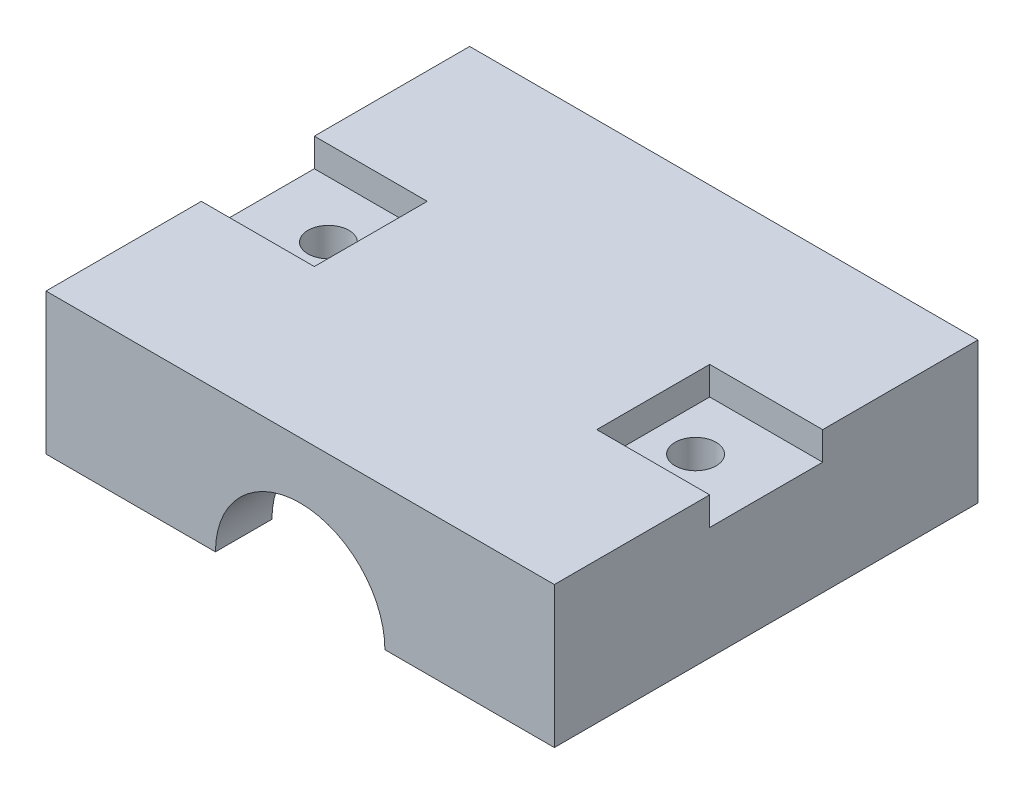
ISO-10303-21;
HEADER;
FILE_DESCRIPTION(('STEP AP214'),'2;1');
FILE_NAME('part.step','',(''),(''),'','','');
FILE_SCHEMA(('AUTOMOTIVE_DESIGN { 1 0 10303 214 1 1 1 1 }'));
ENDSEC;
DATA;
#1=APPLICATION_CONTEXT('core data for automotive mechanical design processes');
#2=APPLICATION_PROTOCOL_DEFINITION('international standard','automotive_design',2000,#1);
#3=PRODUCT_CONTEXT('',#1,'mechanical');
#4=PRODUCT('Part','Part','',(#3));
#5=PRODUCT_RELATED_PRODUCT_CATEGORY('part','',(#4));
#6=PRODUCT_DEFINITION_FORMATION('','',#4);
#7=PRODUCT_DEFINITION_CONTEXT('part definition',#1,'design');
#8=PRODUCT_DEFINITION('design','',#6,#7);
#9=PRODUCT_DEFINITION_SHAPE('','',#8);
#10=(LENGTH_UNIT() NAMED_UNIT(*) SI_UNIT(.MILLI.,.METRE.));
#11=(NAMED_UNIT(*) PLANE_ANGLE_UNIT() SI_UNIT($,.RADIAN.));
#12=(NAMED_UNIT(*) SI_UNIT($,.STERADIAN.) SOLID_ANGLE_UNIT());
#13=UNCERTAINTY_MEASURE_WITH_UNIT(LENGTH_MEASURE(1.E-05),#10,'distance_accuracy_value','');
#14=(GEOMETRIC_REPRESENTATION_CONTEXT(3) GLOBAL_UNCERTAINTY_ASSIGNED_CONTEXT((#13)) GLOBAL_UNIT_ASSIGNED_CONTEXT((#10,
#11,#12)) REPRESENTATION_CONTEXT('',''));
#15=CARTESIAN_POINT('',(0.,0.,0.));
#16=DIRECTION('',(0.,0.,1.));
#17=DIRECTION('',(1.,0.,0.));
#18=AXIS2_PLACEMENT_3D('',#15,#16,#17);
#19=CARTESIAN_POINT('',(-18.,0.,-9.2));
#20=DIRECTION('',(0.,0.,1.));
#21=DIRECTION('',(1.,0.,0.));
#22=AXIS2_PLACEMENT_3D('',#19,#20,#21);
#23=CYLINDRICAL_SURFACE('',#22,8.1);
#24=CARTESIAN_POINT('',(-18.,0.,-4.));
#25=DIRECTION('',(0.,0.,1.));
#26=DIRECTION('',(1.,0.,0.));
#27=AXIS2_PLACEMENT_3D('',#24,#25,#26);
#28=CIRCLE('',#27,8.1);
#29=CARTESIAN_POINT('',(-9.9,0.,-4.));
#30=VERTEX_POINT('',#29);
#31=CARTESIAN_POINT('',(-26.1,0.,-4.));
#32=VERTEX_POINT('',#31);
#33=EDGE_CURVE('E54',#30,#32,#28,.T.);
#34=ORIENTED_EDGE('',*,*,#33,.T.);
#35=DIRECTION('',(0.,0.,1.));
#36=VECTOR('',#35,1.);
#37=CARTESIAN_POINT('',(-26.1,0.,-9.2));
#38=LINE('',#37,#36);
#39=CARTESIAN_POINT('',(-26.1,0.,-9.2));
#40=VERTEX_POINT('',#39);
#41=EDGE_CURVE('E206',#40,#32,#38,.T.);
#42=ORIENTED_EDGE('',*,*,#41,.F.);
#43=CARTESIAN_POINT('',(-18.,0.,-9.2));
#44=DIRECTION('',(0.,0.,1.));
#45=DIRECTION('',(1.,0.,0.));
#46=AXIS2_PLACEMENT_3D('',#43,#44,#45);
#47=CIRCLE('',#46,8.1);
#48=CARTESIAN_POINT('',(-9.9,0.,-9.2));
#49=VERTEX_POINT('',#48);
#50=EDGE_CURVE('E199',#49,#40,#47,.T.);
#51=ORIENTED_EDGE('',*,*,#50,.F.);
#52=DIRECTION('',(0.,0.,1.));
#53=VECTOR('',#52,1.);
#54=CARTESIAN_POINT('',(-9.9,0.,-9.2));
#55=LINE('',#54,#53);
#56=EDGE_CURVE('E50',#49,#30,#55,.T.);
#57=ORIENTED_EDGE('',*,*,#56,.T.);
#58=EDGE_LOOP('',(#34,#42,#51,#57));
#59=FACE_BOUND('',#58,.T.);
#60=ADVANCED_FACE('F35',(#59),#23,.F.);
#61=CARTESIAN_POINT('',(-18.,0.,-20.));
#62=DIRECTION('',(0.,0.,1.));
#63=DIRECTION('',(1.,0.,0.));
#64=AXIS2_PLACEMENT_3D('',#61,#62,#63);
#65=CYLINDRICAL_SURFACE('',#64,6.);
#66=CARTESIAN_POINT('',(-18.,0.,-9.2));
#67=DIRECTION('',(0.,0.,1.));
#68=DIRECTION('',(1.,0.,0.));
#69=AXIS2_PLACEMENT_3D('',#66,#67,#68);
#70=CIRCLE('',#69,6.);
#71=CARTESIAN_POINT('',(-24.,0.,-9.2));
#72=VERTEX_POINT('',#71);
#73=CARTESIAN_POINT('',(-12.,0.,-9.2));
#74=VERTEX_POINT('',#73);
#75=EDGE_CURVE('E11',#72,#74,#70,.F.);
#76=ORIENTED_EDGE('',*,*,#75,.F.);
#77=DIRECTION('',(0.,0.,1.));
#78=VECTOR('',#77,1.);
#79=CARTESIAN_POINT('',(-24.,0.,-20.));
#80=LINE('',#79,#78);
#81=CARTESIAN_POINT('',(-24.,0.,-20.));
#82=VERTEX_POINT('',#81);
#83=EDGE_CURVE('E309',#82,#72,#80,.T.);
#84=ORIENTED_EDGE('',*,*,#83,.F.);
#85=CARTESIAN_POINT('',(-18.,0.,-20.));
#86=DIRECTION('',(0.,0.,1.));
#87=DIRECTION('',(1.,0.,0.));
#88=AXIS2_PLACEMENT_3D('',#85,#86,#87);
#89=CIRCLE('',#88,6.);
#90=CARTESIAN_POINT('',(-12.,0.,-20.));
#91=VERTEX_POINT('',#90);
#92=EDGE_CURVE('E272',#91,#82,#89,.T.);
#93=ORIENTED_EDGE('',*,*,#92,.F.);
#94=DIRECTION('',(0.,0.,1.));
#95=VECTOR('',#94,1.);
#96=CARTESIAN_POINT('',(-12.,0.,-20.));
#97=LINE('',#96,#95);
#98=EDGE_CURVE('E307',#74,#91,#97,.F.);
#99=ORIENTED_EDGE('',*,*,#98,.F.);
#100=EDGE_LOOP('',(#76,#84,#93,#99));
#101=FACE_BOUND('',#100,.T.);
#102=ADVANCED_FACE('F367',(#101),#65,.F.);
#103=CARTESIAN_POINT('',(0.,10.,0.));
#104=DIRECTION('',(-1.,0.,0.));
#105=DIRECTION('',(0.,0.,1.));
#106=AXIS2_PLACEMENT_3D('',#103,#104,#105);
#107=PLANE('',#106);
#108=DIRECTION('',(0.,0.,1.));
#109=VECTOR('',#108,1.);
#110=CARTESIAN_POINT('',(0.,8.,-11.));
#111=LINE('',#110,#109);
#112=CARTESIAN_POINT('',(0.,8.,-19.));
#113=VERTEX_POINT('',#112);
#114=CARTESIAN_POINT('',(0.,8.,-11.));
#115=VERTEX_POINT('',#114);
#116=EDGE_CURVE('E240',#113,#115,#111,.T.);
#117=ORIENTED_EDGE('',*,*,#116,.T.);
#118=DIRECTION('',(0.,-1.,0.));
#119=VECTOR('',#118,1.);
#120=CARTESIAN_POINT('',(0.,16.,-11.));
#121=LINE('',#120,#119);
#122=CARTESIAN_POINT('',(0.,10.,-11.));
#123=VERTEX_POINT('',#122);
#124=EDGE_CURVE('E214',#123,#115,#121,.T.);
#125=ORIENTED_EDGE('',*,*,#124,.F.);
#126=DIRECTION('',(0.,0.,-1.));
#127=VECTOR('',#126,1.);
#128=CARTESIAN_POINT('',(0.,10.,0.));
#129=LINE('',#128,#127);
#130=CARTESIAN_POINT('',(0.,10.,0.));
#131=VERTEX_POINT('',#130);
#132=EDGE_CURVE('E275',#131,#123,#129,.T.);
#133=ORIENTED_EDGE('',*,*,#132,.F.);
#134=DIRECTION('',(0.,-1.,0.));
#135=VECTOR('',#134,1.);
#136=CARTESIAN_POINT('',(0.,10.,0.));
#137=LINE('',#136,#135);
#138=CARTESIAN_POINT('',(0.,0.,0.));
#139=VERTEX_POINT('',#138);
#140=EDGE_CURVE('E287',#131,#139,#137,.T.);
#141=ORIENTED_EDGE('',*,*,#140,.T.);
#142=DIRECTION('',(0.,0.,-1.));
#143=VECTOR('',#142,1.);
#144=CARTESIAN_POINT('',(0.,0.,0.));
#145=LINE('',#144,#143);
#146=CARTESIAN_POINT('',(0.,0.,-30.));
#147=VERTEX_POINT('',#146);
#148=EDGE_CURVE('E274',#139,#147,#145,.T.);
#149=ORIENTED_EDGE('',*,*,#148,.T.);
#150=DIRECTION('',(0.,-1.,0.));
#151=VECTOR('',#150,1.);
#152=CARTESIAN_POINT('',(0.,10.,-30.));
#153=LINE('',#152,#151);
#154=CARTESIAN_POINT('',(0.,10.,-30.));
#155=VERTEX_POINT('',#154);
#156=EDGE_CURVE('E304',#155,#147,#153,.T.);
#157=ORIENTED_EDGE('',*,*,#156,.F.);
#158=CARTESIAN_POINT('',(0.,10.,-19.));
#159=VERTEX_POINT('',#158);
#160=EDGE_CURVE('E279',#159,#155,#129,.T.);
#161=ORIENTED_EDGE('',*,*,#160,.F.);
#162=DIRECTION('',(0.,-1.,0.));
#163=VECTOR('',#162,1.);
#164=CARTESIAN_POINT('',(0.,16.,-19.));
#165=LINE('',#164,#163);
#166=EDGE_CURVE('E245',#159,#113,#165,.T.);
#167=ORIENTED_EDGE('',*,*,#166,.T.);
#168=EDGE_LOOP('',(#117,#125,#133,#141,#149,#157,#161,#167));
#169=FACE_BOUND('',#168,.T.);
#170=ADVANCED_FACE('F37',(#169),#107,.F.);
#171=CARTESIAN_POINT('',(0.,10.,-30.));
#172=DIRECTION('',(0.,0.,1.));
#173=DIRECTION('',(1.,0.,0.));
#174=AXIS2_PLACEMENT_3D('',#171,#172,#173);
#175=PLANE('',#174);
#176=DIRECTION('',(-1.,0.,0.));
#177=VECTOR('',#176,1.);
#178=CARTESIAN_POINT('',(0.,0.,-30.));
#179=LINE('',#178,#177);
#180=CARTESIAN_POINT('',(-36.,0.,-30.));
#181=VERTEX_POINT('',#180);
#182=EDGE_CURVE('E290',#147,#181,#179,.T.);
#183=ORIENTED_EDGE('',*,*,#182,.T.);
#184=DIRECTION('',(0.,-1.,0.));
#185=VECTOR('',#184,1.);
#186=CARTESIAN_POINT('',(-36.,10.,-30.));
#187=LINE('',#186,#185);
#188=CARTESIAN_POINT('',(-36.,10.,-30.));
#189=VERTEX_POINT('',#188);
#190=EDGE_CURVE('E301',#189,#181,#187,.T.);
#191=ORIENTED_EDGE('',*,*,#190,.F.);
#192=DIRECTION('',(-1.,0.,0.));
#193=VECTOR('',#192,1.);
#194=CARTESIAN_POINT('',(0.,10.,-30.));
#195=LINE('',#194,#193);
#196=EDGE_CURVE('E278',#155,#189,#195,.T.);
#197=ORIENTED_EDGE('',*,*,#196,.F.);
#198=ORIENTED_EDGE('',*,*,#156,.T.);
#199=EDGE_LOOP('',(#183,#191,#197,#198));
#200=FACE_BOUND('',#199,.T.);
#201=ADVANCED_FACE('F559',(#200),#175,.F.);
#202=CARTESIAN_POINT('',(-36.,10.,0.));
#203=DIRECTION('',(1.,0.,0.));
#204=DIRECTION('',(0.,0.,-1.));
#205=AXIS2_PLACEMENT_3D('',#202,#203,#204);
#206=PLANE('',#205);
#207=DIRECTION('',(0.,0.,1.));
#208=VECTOR('',#207,1.);
#209=CARTESIAN_POINT('',(-36.,10.,0.));
#210=LINE('',#209,#208);
#211=CARTESIAN_POINT('',(-36.,10.,-11.));
#212=VERTEX_POINT('',#211);
#213=CARTESIAN_POINT('',(-36.,10.,0.));
#214=VERTEX_POINT('',#213);
#215=EDGE_CURVE('E281',#212,#214,#210,.T.);
#216=ORIENTED_EDGE('',*,*,#215,.F.);
#217=DIRECTION('',(0.,-1.,0.));
#218=VECTOR('',#217,1.);
#219=CARTESIAN_POINT('',(-36.,16.,-11.));
#220=LINE('',#219,#218);
#221=CARTESIAN_POINT('',(-36.,8.,-11.));
#222=VERTEX_POINT('',#221);
#223=EDGE_CURVE('E224',#212,#222,#220,.T.);
#224=ORIENTED_EDGE('',*,*,#223,.T.);
#225=DIRECTION('',(0.,0.,-1.));
#226=VECTOR('',#225,1.);
#227=CARTESIAN_POINT('',(-36.,8.,-11.));
#228=LINE('',#227,#226);
#229=CARTESIAN_POINT('',(-36.,8.,-19.));
#230=VERTEX_POINT('',#229);
#231=EDGE_CURVE('E210',#222,#230,#228,.T.);
#232=ORIENTED_EDGE('',*,*,#231,.T.);
#233=DIRECTION('',(0.,-1.,0.));
#234=VECTOR('',#233,1.);
#235=CARTESIAN_POINT('',(-36.,16.,-19.));
#236=LINE('',#235,#234);
#237=CARTESIAN_POINT('',(-36.,10.,-19.));
#238=VERTEX_POINT('',#237);
#239=EDGE_CURVE('E223',#238,#230,#236,.T.);
#240=ORIENTED_EDGE('',*,*,#239,.F.);
#241=EDGE_CURVE('E282',#189,#238,#210,.T.);
#242=ORIENTED_EDGE('',*,*,#241,.F.);
#243=ORIENTED_EDGE('',*,*,#190,.T.);
#244=DIRECTION('',(0.,0.,1.));
#245=VECTOR('',#244,1.);
#246=CARTESIAN_POINT('',(-36.,0.,0.));
#247=LINE('',#246,#245);
#248=CARTESIAN_POINT('',(-36.,0.,0.));
#249=VERTEX_POINT('',#248);
#250=EDGE_CURVE('E292',#181,#249,#247,.T.);
#251=ORIENTED_EDGE('',*,*,#250,.T.);
#252=DIRECTION('',(0.,-1.,0.));
#253=VECTOR('',#252,1.);
#254=CARTESIAN_POINT('',(-36.,10.,0.));
#255=LINE('',#254,#253);
#256=EDGE_CURVE('E298',#214,#249,#255,.T.);
#257=ORIENTED_EDGE('',*,*,#256,.F.);
#258=EDGE_LOOP('',(#216,#224,#232,#240,#242,#243,#251,#257));
#259=FACE_BOUND('',#258,.T.);
#260=ADVANCED_FACE('F350',(#259),#206,.F.);
#261=CARTESIAN_POINT('',(0.,10.,0.));
#262=DIRECTION('',(0.,0.,-1.));
#263=DIRECTION('',(-1.,0.,0.));
#264=AXIS2_PLACEMENT_3D('',#261,#262,#263);
#265=PLANE('',#264);
#266=DIRECTION('',(1.,0.,0.));
#267=VECTOR('',#266,1.);
#268=CARTESIAN_POINT('',(0.,0.,0.));
#269=LINE('',#268,#267);
#270=CARTESIAN_POINT('',(-24.,0.,0.));
#271=VERTEX_POINT('',#270);
#272=EDGE_CURVE('E294',#249,#271,#269,.T.);
#273=ORIENTED_EDGE('',*,*,#272,.T.);
#274=CARTESIAN_POINT('',(-18.,0.,0.));
#275=DIRECTION('',(0.,0.,-1.));
#276=DIRECTION('',(1.,0.,0.));
#277=AXIS2_PLACEMENT_3D('',#274,#275,#276);
#278=CIRCLE('',#277,6.);
#279=CARTESIAN_POINT('',(-12.,0.,0.));
#280=VERTEX_POINT('',#279);
#281=EDGE_CURVE('E193',#271,#280,#278,.T.);
#282=ORIENTED_EDGE('',*,*,#281,.T.);
#283=EDGE_CURVE('E176',#280,#139,#269,.T.);
#284=ORIENTED_EDGE('',*,*,#283,.T.);
#285=ORIENTED_EDGE('',*,*,#140,.F.);
#286=DIRECTION('',(1.,0.,0.));
#287=VECTOR('',#286,1.);
#288=CARTESIAN_POINT('',(0.,10.,0.));
#289=LINE('',#288,#287);
#290=EDGE_CURVE('E285',#214,#131,#289,.T.);
#291=ORIENTED_EDGE('',*,*,#290,.F.);
#292=ORIENTED_EDGE('',*,*,#256,.T.);
#293=EDGE_LOOP('',(#273,#282,#284,#285,#291,#292));
#294=FACE_BOUND('',#293,.T.);
#295=ADVANCED_FACE('F401',(#294),#265,.F.);
#296=CARTESIAN_POINT('',(0.,10.,0.));
#297=DIRECTION('',(0.,1.,0.));
#298=DIRECTION('',(0.,0.,1.));
#299=AXIS2_PLACEMENT_3D('',#296,#297,#298);
#300=PLANE('',#299);
#301=DIRECTION('',(1.,0.,0.));
#302=VECTOR('',#301,1.);
#303=CARTESIAN_POINT('',(0.,10.,-11.));
#304=LINE('',#303,#302);
#305=CARTESIAN_POINT('',(-28.,10.,-11.));
#306=VERTEX_POINT('',#305);
#307=EDGE_CURVE('E43',#212,#306,#304,.T.);
#308=ORIENTED_EDGE('',*,*,#307,.F.);
#309=ORIENTED_EDGE('',*,*,#215,.T.);
#310=ORIENTED_EDGE('',*,*,#290,.T.);
#311=ORIENTED_EDGE('',*,*,#132,.T.);
#312=DIRECTION('',(1.,0.,0.));
#313=VECTOR('',#312,1.);
#314=CARTESIAN_POINT('',(0.,10.,-11.));
#315=LINE('',#314,#313);
#316=CARTESIAN_POINT('',(-7.99999999999999,10.,-11.));
#317=VERTEX_POINT('',#316);
#318=EDGE_CURVE('E325',#317,#123,#315,.T.);
#319=ORIENTED_EDGE('',*,*,#318,.F.);
#320=DIRECTION('',(0.,0.,1.));
#321=VECTOR('',#320,1.);
#322=CARTESIAN_POINT('',(-7.99999999999999,10.,0.));
#323=LINE('',#322,#321);
#324=CARTESIAN_POINT('',(-7.99999999999999,10.,-19.));
#325=VERTEX_POINT('',#324);
#326=EDGE_CURVE('E320',#325,#317,#323,.T.);
#327=ORIENTED_EDGE('',*,*,#326,.F.);
#328=DIRECTION('',(-1.,0.,0.));
#329=VECTOR('',#328,1.);
#330=CARTESIAN_POINT('',(0.,10.,-19.));
#331=LINE('',#330,#329);
#332=EDGE_CURVE('E322',#159,#325,#331,.T.);
#333=ORIENTED_EDGE('',*,*,#332,.F.);
#334=ORIENTED_EDGE('',*,*,#160,.T.);
#335=ORIENTED_EDGE('',*,*,#196,.T.);
#336=ORIENTED_EDGE('',*,*,#241,.T.);
#337=DIRECTION('',(-1.,0.,0.));
#338=VECTOR('',#337,1.);
#339=CARTESIAN_POINT('',(0.,10.,-19.));
#340=LINE('',#339,#338);
#341=CARTESIAN_POINT('',(-28.,10.,-19.));
#342=VERTEX_POINT('',#341);
#343=EDGE_CURVE('E327',#342,#238,#340,.T.);
#344=ORIENTED_EDGE('',*,*,#343,.F.);
#345=DIRECTION('',(0.,0.,-1.));
#346=VECTOR('',#345,1.);
#347=CARTESIAN_POINT('',(-28.,10.,0.));
#348=LINE('',#347,#346);
#349=EDGE_CURVE('E329',#306,#342,#348,.T.);
#350=ORIENTED_EDGE('',*,*,#349,.F.);
#351=EDGE_LOOP('',(#308,#309,#310,#311,#319,#327,#333,#334,#335,#336,#344,#350));
#352=FACE_BOUND('',#351,.T.);
#353=ADVANCED_FACE('F343',(#352),#300,.T.);
#354=CARTESIAN_POINT('',(0.,0.,0.));
#355=DIRECTION('',(0.,1.,0.));
#356=DIRECTION('',(0.,0.,1.));
#357=AXIS2_PLACEMENT_3D('',#354,#355,#356);
#358=PLANE('',#357);
#359=CARTESIAN_POINT('',(-31.,0.,-15.));
#360=DIRECTION('',(0.,-1.,0.));
#361=DIRECTION('',(0.,0.,-1.));
#362=AXIS2_PLACEMENT_3D('',#359,#360,#361);
#363=CIRCLE('',#362,1.45);
#364=CARTESIAN_POINT('',(-31.,0.,-16.45));
#365=VERTEX_POINT('',#364);
#366=EDGE_CURVE('E254',#365,#365,#363,.T.);
#367=ORIENTED_EDGE('',*,*,#366,.F.);
#368=EDGE_LOOP('',(#367));
#369=FACE_BOUND('',#368,.T.);
#370=CARTESIAN_POINT('',(-5.,0.,-15.));
#371=DIRECTION('',(0.,-1.,0.));
#372=DIRECTION('',(0.,0.,1.));
#373=AXIS2_PLACEMENT_3D('',#370,#371,#372);
#374=CIRCLE('',#373,1.45);
#375=CARTESIAN_POINT('',(-5.,0.,-13.55));
#376=VERTEX_POINT('',#375);
#377=EDGE_CURVE('E258',#376,#376,#374,.T.);
#378=ORIENTED_EDGE('',*,*,#377,.F.);
#379=EDGE_LOOP('',(#378));
#380=FACE_BOUND('',#379,.T.);
#381=DIRECTION('',(1.,0.,0.));
#382=VECTOR('',#381,1.);
#383=CARTESIAN_POINT('',(-26.1,0.,-9.2));
#384=LINE('',#383,#382);
#385=EDGE_CURVE('E204',#40,#72,#384,.T.);
#386=ORIENTED_EDGE('',*,*,#385,.F.);
#387=ORIENTED_EDGE('',*,*,#41,.T.);
#388=DIRECTION('',(1.,0.,0.));
#389=VECTOR('',#388,1.);
#390=CARTESIAN_POINT('',(-26.1,0.,-4.));
#391=LINE('',#390,#389);
#392=CARTESIAN_POINT('',(-24.,0.,-4.));
#393=VERTEX_POINT('',#392);
#394=EDGE_CURVE('E182',#32,#393,#391,.T.);
#395=ORIENTED_EDGE('',*,*,#394,.T.);
#396=DIRECTION('',(0.,0.,1.));
#397=VECTOR('',#396,1.);
#398=CARTESIAN_POINT('',(-24.,0.,-4.));
#399=LINE('',#398,#397);
#400=EDGE_CURVE('E181',#393,#271,#399,.T.);
#401=ORIENTED_EDGE('',*,*,#400,.T.);
#402=ORIENTED_EDGE('',*,*,#272,.F.);
#403=ORIENTED_EDGE('',*,*,#250,.F.);
#404=ORIENTED_EDGE('',*,*,#182,.F.);
#405=ORIENTED_EDGE('',*,*,#148,.F.);
#406=ORIENTED_EDGE('',*,*,#283,.F.);
#407=DIRECTION('',(0.,0.,1.));
#408=VECTOR('',#407,1.);
#409=CARTESIAN_POINT('',(-12.,0.,-4.));
#410=LINE('',#409,#408);
#411=CARTESIAN_POINT('',(-12.,0.,-4.));
#412=VERTEX_POINT('',#411);
#413=EDGE_CURVE('E170',#412,#280,#410,.T.);
#414=ORIENTED_EDGE('',*,*,#413,.F.);
#415=DIRECTION('',(1.,0.,0.));
#416=VECTOR('',#415,1.);
#417=CARTESIAN_POINT('',(-12.,0.,-4.));
#418=LINE('',#417,#416);
#419=EDGE_CURVE('E174',#412,#30,#418,.T.);
#420=ORIENTED_EDGE('',*,*,#419,.T.);
#421=ORIENTED_EDGE('',*,*,#56,.F.);
#422=EDGE_CURVE('E203',#74,#49,#384,.T.);
#423=ORIENTED_EDGE('',*,*,#422,.F.);
#424=ORIENTED_EDGE('',*,*,#98,.T.);
#425=DIRECTION('',(1.,0.,0.));
#426=VECTOR('',#425,1.);
#427=CARTESIAN_POINT('',(0.,0.,-20.));
#428=LINE('',#427,#426);
#429=CARTESIAN_POINT('',(-9.9,0.,-20.));
#430=VERTEX_POINT('',#429);
#431=EDGE_CURVE('E266',#91,#430,#428,.T.);
#432=ORIENTED_EDGE('',*,*,#431,.T.);
#433=DIRECTION('',(0.,0.,1.));
#434=VECTOR('',#433,1.);
#435=CARTESIAN_POINT('',(-9.9,0.,-25.2));
#436=LINE('',#435,#434);
#437=CARTESIAN_POINT('',(-9.9,0.,-25.2));
#438=VERTEX_POINT('',#437);
#439=EDGE_CURVE('E312',#430,#438,#436,.F.);
#440=ORIENTED_EDGE('',*,*,#439,.T.);
#441=DIRECTION('',(1.,0.,0.));
#442=VECTOR('',#441,1.);
#443=CARTESIAN_POINT('',(0.,0.,-25.2));
#444=LINE('',#443,#442);
#445=CARTESIAN_POINT('',(-26.1,0.,-25.2));
#446=VERTEX_POINT('',#445);
#447=EDGE_CURVE('E315',#446,#438,#444,.T.);
#448=ORIENTED_EDGE('',*,*,#447,.F.);
#449=DIRECTION('',(0.,0.,1.));
#450=VECTOR('',#449,1.);
#451=CARTESIAN_POINT('',(-26.1,0.,-25.2));
#452=LINE('',#451,#450);
#453=CARTESIAN_POINT('',(-26.1,0.,-20.));
#454=VERTEX_POINT('',#453);
#455=EDGE_CURVE('E317',#446,#454,#452,.T.);
#456=ORIENTED_EDGE('',*,*,#455,.T.);
#457=EDGE_CURVE('E271',#454,#82,#428,.T.);
#458=ORIENTED_EDGE('',*,*,#457,.T.);
#459=ORIENTED_EDGE('',*,*,#83,.T.);
#460=EDGE_LOOP('',(#386,#387,#395,#401,#402,#403,#404,#405,#406,#414,#420,#421,#423,#424,#432,
#440,#448,#456,#458,#459));
#461=FACE_BOUND('',#460,.T.);
#462=ADVANCED_FACE('F173',(#369,#380,#461),#358,.F.);
#463=CARTESIAN_POINT('',(-18.,0.,-25.2));
#464=DIRECTION('',(0.,0.,1.));
#465=DIRECTION('',(1.,0.,0.));
#466=AXIS2_PLACEMENT_3D('',#463,#464,#465);
#467=CYLINDRICAL_SURFACE('',#466,8.1);
#468=CARTESIAN_POINT('',(-18.,0.,-25.2));
#469=DIRECTION('',(0.,0.,1.));
#470=DIRECTION('',(1.,0.,0.));
#471=AXIS2_PLACEMENT_3D('',#468,#469,#470);
#472=CIRCLE('',#471,8.1);
#473=EDGE_CURVE('E263',#438,#446,#472,.T.);
#474=ORIENTED_EDGE('',*,*,#473,.F.);
#475=ORIENTED_EDGE('',*,*,#439,.F.);
#476=CARTESIAN_POINT('',(-18.,0.,-20.));
#477=DIRECTION('',(0.,0.,1.));
#478=DIRECTION('',(1.,0.,0.));
#479=AXIS2_PLACEMENT_3D('',#476,#477,#478);
#480=CIRCLE('',#479,8.1);
#481=EDGE_CURVE('E257',#430,#454,#480,.T.);
#482=ORIENTED_EDGE('',*,*,#481,.T.);
#483=ORIENTED_EDGE('',*,*,#455,.F.);
#484=EDGE_LOOP('',(#474,#475,#482,#483));
#485=FACE_BOUND('',#484,.T.);
#486=ADVANCED_FACE('F416',(#485),#467,.F.);
#487=CARTESIAN_POINT('',(-18.,0.,-25.2));
#488=DIRECTION('',(0.,0.,1.));
#489=DIRECTION('',(1.,0.,0.));
#490=AXIS2_PLACEMENT_3D('',#487,#488,#489);
#491=PLANE('',#490);
#492=ORIENTED_EDGE('',*,*,#447,.T.);
#493=ORIENTED_EDGE('',*,*,#473,.T.);
#494=EDGE_LOOP('',(#492,#493));
#495=FACE_BOUND('',#494,.T.);
#496=ADVANCED_FACE('F428',(#495),#491,.T.);
#497=CARTESIAN_POINT('',(-18.,0.,-20.));
#498=DIRECTION('',(0.,0.,1.));
#499=DIRECTION('',(1.,0.,0.));
#500=AXIS2_PLACEMENT_3D('',#497,#498,#499);
#501=PLANE('',#500);
#502=ORIENTED_EDGE('',*,*,#481,.F.);
#503=ORIENTED_EDGE('',*,*,#431,.F.);
#504=ORIENTED_EDGE('',*,*,#92,.T.);
#505=ORIENTED_EDGE('',*,*,#457,.F.);
#506=EDGE_LOOP('',(#502,#503,#504,#505));
#507=FACE_BOUND('',#506,.T.);
#508=ADVANCED_FACE('F437',(#507),#501,.F.);
#509=CARTESIAN_POINT('',(-5.,8.,-15.));
#510=DIRECTION('',(0.,-1.,0.));
#511=DIRECTION('',(0.,0.,-1.));
#512=AXIS2_PLACEMENT_3D('',#509,#510,#511);
#513=CYLINDRICAL_SURFACE('',#512,1.45);
#514=CARTESIAN_POINT('',(-5.,8.,-15.));
#515=DIRECTION('',(0.,-1.,0.));
#516=DIRECTION('',(0.,0.,1.));
#517=AXIS2_PLACEMENT_3D('',#514,#515,#516);
#518=CIRCLE('',#517,1.45);
#519=CARTESIAN_POINT('',(-5.,8.,-13.55));
#520=VERTEX_POINT('',#519);
#521=EDGE_CURVE('E253',#520,#520,#518,.T.);
#522=ORIENTED_EDGE('',*,*,#521,.F.);
#523=EDGE_LOOP('',(#522));
#524=FACE_BOUND('',#523,.T.);
#525=ORIENTED_EDGE('',*,*,#377,.T.);
#526=EDGE_LOOP('',(#525));
#527=FACE_BOUND('',#526,.T.);
#528=ADVANCED_FACE('F445',(#524,#527),#513,.F.);
#529=CARTESIAN_POINT('',(-31.,8.,-15.));
#530=DIRECTION('',(0.,-1.,0.));
#531=DIRECTION('',(0.,0.,-1.));
#532=AXIS2_PLACEMENT_3D('',#529,#530,#531);
#533=CYLINDRICAL_SURFACE('',#532,1.45);
#534=CARTESIAN_POINT('',(-31.,8.,-15.));
#535=DIRECTION('',(0.,-1.,0.));
#536=DIRECTION('',(0.,0.,-1.));
#537=AXIS2_PLACEMENT_3D('',#534,#535,#536);
#538=CIRCLE('',#537,1.45);
#539=CARTESIAN_POINT('',(-31.,8.,-16.45));
#540=VERTEX_POINT('',#539);
#541=EDGE_CURVE('E227',#540,#540,#538,.T.);
#542=ORIENTED_EDGE('',*,*,#541,.F.);
#543=EDGE_LOOP('',(#542));
#544=FACE_BOUND('',#543,.T.);
#545=ORIENTED_EDGE('',*,*,#366,.T.);
#546=EDGE_LOOP('',(#545));
#547=FACE_BOUND('',#546,.T.);
#548=ADVANCED_FACE('F453',(#544,#547),#533,.F.);
#549=CARTESIAN_POINT('',(0.,16.,-11.));
#550=DIRECTION('',(0.,0.,1.));
#551=DIRECTION('',(1.,0.,0.));
#552=AXIS2_PLACEMENT_3D('',#549,#550,#551);
#553=PLANE('',#552);
#554=ORIENTED_EDGE('',*,*,#318,.T.);
#555=ORIENTED_EDGE('',*,*,#124,.T.);
#556=DIRECTION('',(-1.,0.,0.));
#557=VECTOR('',#556,1.);
#558=CARTESIAN_POINT('',(0.,8.,-11.));
#559=LINE('',#558,#557);
#560=CARTESIAN_POINT('',(-7.99999999999999,8.,-11.));
#561=VERTEX_POINT('',#560);
#562=EDGE_CURVE('E208',#115,#561,#559,.T.);
#563=ORIENTED_EDGE('',*,*,#562,.T.);
#564=DIRECTION('',(0.,-1.,0.));
#565=VECTOR('',#564,1.);
#566=CARTESIAN_POINT('',(-7.99999999999999,16.,-11.));
#567=LINE('',#566,#565);
#568=EDGE_CURVE('E243',#317,#561,#567,.T.);
#569=ORIENTED_EDGE('',*,*,#568,.F.);
#570=EDGE_LOOP('',(#554,#555,#563,#569));
#571=FACE_BOUND('',#570,.T.);
#572=ADVANCED_FACE('F461',(#571),#553,.F.);
#573=CARTESIAN_POINT('',(0.,16.,-19.));
#574=DIRECTION('',(0.,0.,-1.));
#575=DIRECTION('',(-1.,0.,0.));
#576=AXIS2_PLACEMENT_3D('',#573,#574,#575);
#577=PLANE('',#576);
#578=ORIENTED_EDGE('',*,*,#332,.T.);
#579=DIRECTION('',(0.,-1.,0.));
#580=VECTOR('',#579,1.);
#581=CARTESIAN_POINT('',(-7.99999999999999,16.,-19.));
#582=LINE('',#581,#580);
#583=CARTESIAN_POINT('',(-7.99999999999999,8.,-19.));
#584=VERTEX_POINT('',#583);
#585=EDGE_CURVE('E248',#325,#584,#582,.T.);
#586=ORIENTED_EDGE('',*,*,#585,.T.);
#587=DIRECTION('',(1.,0.,0.));
#588=VECTOR('',#587,1.);
#589=CARTESIAN_POINT('',(0.,8.,-19.));
#590=LINE('',#589,#588);
#591=EDGE_CURVE('E238',#584,#113,#590,.T.);
#592=ORIENTED_EDGE('',*,*,#591,.T.);
#593=ORIENTED_EDGE('',*,*,#166,.F.);
#594=EDGE_LOOP('',(#578,#586,#592,#593));
#595=FACE_BOUND('',#594,.T.);
#596=ADVANCED_FACE('F470',(#595),#577,.F.);
#597=CARTESIAN_POINT('',(-7.99999999999999,16.,-11.));
#598=DIRECTION('',(-1.,0.,0.));
#599=DIRECTION('',(0.,0.,1.));
#600=AXIS2_PLACEMENT_3D('',#597,#598,#599);
#601=PLANE('',#600);
#602=ORIENTED_EDGE('',*,*,#326,.T.);
#603=ORIENTED_EDGE('',*,*,#568,.T.);
#604=DIRECTION('',(0.,0.,-1.));
#605=VECTOR('',#604,1.);
#606=CARTESIAN_POINT('',(-7.99999999999999,8.,-11.));
#607=LINE('',#606,#605);
#608=EDGE_CURVE('E235',#561,#584,#607,.T.);
#609=ORIENTED_EDGE('',*,*,#608,.T.);
#610=ORIENTED_EDGE('',*,*,#585,.F.);
#611=EDGE_LOOP('',(#602,#603,#609,#610));
#612=FACE_BOUND('',#611,.T.);
#613=ADVANCED_FACE('F478',(#612),#601,.F.);
#614=CARTESIAN_POINT('',(0.,8.,0.));
#615=DIRECTION('',(0.,-1.,0.));
#616=DIRECTION('',(0.,0.,-1.));
#617=AXIS2_PLACEMENT_3D('',#614,#615,#616);
#618=PLANE('',#617);
#619=ORIENTED_EDGE('',*,*,#521,.T.);
#620=EDGE_LOOP('',(#619));
#621=FACE_BOUND('',#620,.T.);
#622=ORIENTED_EDGE('',*,*,#562,.F.);
#623=ORIENTED_EDGE('',*,*,#116,.F.);
#624=ORIENTED_EDGE('',*,*,#591,.F.);
#625=ORIENTED_EDGE('',*,*,#608,.F.);
#626=EDGE_LOOP('',(#622,#623,#624,#625));
#627=FACE_BOUND('',#626,.T.);
#628=ADVANCED_FACE('F486',(#621,#627),#618,.F.);
#629=CARTESIAN_POINT('',(-36.,16.,-11.));
#630=DIRECTION('',(0.,0.,1.));
#631=DIRECTION('',(1.,0.,0.));
#632=AXIS2_PLACEMENT_3D('',#629,#630,#631);
#633=PLANE('',#632);
#634=ORIENTED_EDGE('',*,*,#307,.T.);
#635=DIRECTION('',(0.,-1.,0.));
#636=VECTOR('',#635,1.);
#637=CARTESIAN_POINT('',(-28.,16.,-11.));
#638=LINE('',#637,#636);
#639=CARTESIAN_POINT('',(-28.,8.,-11.));
#640=VERTEX_POINT('',#639);
#641=EDGE_CURVE('E228',#306,#640,#638,.T.);
#642=ORIENTED_EDGE('',*,*,#641,.T.);
#643=DIRECTION('',(-1.,0.,0.));
#644=VECTOR('',#643,1.);
#645=CARTESIAN_POINT('',(-36.,8.,-11.));
#646=LINE('',#645,#644);
#647=EDGE_CURVE('E220',#640,#222,#646,.T.);
#648=ORIENTED_EDGE('',*,*,#647,.T.);
#649=ORIENTED_EDGE('',*,*,#223,.F.);
#650=EDGE_LOOP('',(#634,#642,#648,#649));
#651=FACE_BOUND('',#650,.T.);
#652=ADVANCED_FACE('F334',(#651),#633,.F.);
#653=CARTESIAN_POINT('',(-28.,16.,-11.));
#654=DIRECTION('',(1.,0.,0.));
#655=DIRECTION('',(0.,0.,-1.));
#656=AXIS2_PLACEMENT_3D('',#653,#654,#655);
#657=PLANE('',#656);
#658=ORIENTED_EDGE('',*,*,#349,.T.);
#659=DIRECTION('',(0.,-1.,0.));
#660=VECTOR('',#659,1.);
#661=CARTESIAN_POINT('',(-28.,16.,-19.));
#662=LINE('',#661,#660);
#663=CARTESIAN_POINT('',(-28.,8.,-19.));
#664=VERTEX_POINT('',#663);
#665=EDGE_CURVE('E230',#342,#664,#662,.T.);
#666=ORIENTED_EDGE('',*,*,#665,.T.);
#667=DIRECTION('',(0.,0.,1.));
#668=VECTOR('',#667,1.);
#669=CARTESIAN_POINT('',(-28.,8.,-11.));
#670=LINE('',#669,#668);
#671=EDGE_CURVE('E217',#664,#640,#670,.T.);
#672=ORIENTED_EDGE('',*,*,#671,.T.);
#673=ORIENTED_EDGE('',*,*,#641,.F.);
#674=EDGE_LOOP('',(#658,#666,#672,#673));
#675=FACE_BOUND('',#674,.T.);
#676=ADVANCED_FACE('F339',(#675),#657,.F.);
#677=CARTESIAN_POINT('',(-36.,16.,-19.));
#678=DIRECTION('',(0.,0.,-1.));
#679=DIRECTION('',(-1.,0.,0.));
#680=AXIS2_PLACEMENT_3D('',#677,#678,#679);
#681=PLANE('',#680);
#682=ORIENTED_EDGE('',*,*,#343,.T.);
#683=ORIENTED_EDGE('',*,*,#239,.T.);
#684=DIRECTION('',(1.,0.,0.));
#685=VECTOR('',#684,1.);
#686=CARTESIAN_POINT('',(-36.,8.,-19.));
#687=LINE('',#686,#685);
#688=EDGE_CURVE('E213',#230,#664,#687,.T.);
#689=ORIENTED_EDGE('',*,*,#688,.T.);
#690=ORIENTED_EDGE('',*,*,#665,.F.);
#691=EDGE_LOOP('',(#682,#683,#689,#690));
#692=FACE_BOUND('',#691,.T.);
#693=ADVANCED_FACE('F347',(#692),#681,.F.);
#694=CARTESIAN_POINT('',(0.,8.,0.));
#695=DIRECTION('',(0.,-1.,0.));
#696=DIRECTION('',(0.,0.,-1.));
#697=AXIS2_PLACEMENT_3D('',#694,#695,#696);
#698=PLANE('',#697);
#699=ORIENTED_EDGE('',*,*,#541,.T.);
#700=EDGE_LOOP('',(#699));
#701=FACE_BOUND('',#700,.T.);
#702=ORIENTED_EDGE('',*,*,#231,.F.);
#703=ORIENTED_EDGE('',*,*,#647,.F.);
#704=ORIENTED_EDGE('',*,*,#671,.F.);
#705=ORIENTED_EDGE('',*,*,#688,.F.);
#706=EDGE_LOOP('',(#702,#703,#704,#705));
#707=FACE_BOUND('',#706,.T.);
#708=ADVANCED_FACE('F352',(#701,#707),#698,.F.);
#709=CARTESIAN_POINT('',(-18.,0.,-9.2));
#710=DIRECTION('',(0.,0.,1.));
#711=DIRECTION('',(1.,0.,0.));
#712=AXIS2_PLACEMENT_3D('',#709,#710,#711);
#713=PLANE('',#712);
#714=ORIENTED_EDGE('',*,*,#75,.T.);
#715=ORIENTED_EDGE('',*,*,#422,.T.);
#716=ORIENTED_EDGE('',*,*,#50,.T.);
#717=ORIENTED_EDGE('',*,*,#385,.T.);
#718=EDGE_LOOP('',(#714,#715,#716,#717));
#719=FACE_BOUND('',#718,.T.);
#720=ADVANCED_FACE('F354',(#719),#713,.T.);
#721=CARTESIAN_POINT('',(-18.,0.,-4.));
#722=DIRECTION('',(0.,0.,1.));
#723=DIRECTION('',(1.,0.,0.));
#724=AXIS2_PLACEMENT_3D('',#721,#722,#723);
#725=CYLINDRICAL_SURFACE('',#724,6.);
#726=ORIENTED_EDGE('',*,*,#281,.F.);
#727=ORIENTED_EDGE('',*,*,#400,.F.);
#728=CARTESIAN_POINT('',(-18.,0.,-4.));
#729=DIRECTION('',(0.,0.,-1.));
#730=DIRECTION('',(1.,0.,0.));
#731=AXIS2_PLACEMENT_3D('',#728,#729,#730);
#732=CIRCLE('',#731,6.);
#733=EDGE_CURVE('E188',#393,#412,#732,.T.);
#734=ORIENTED_EDGE('',*,*,#733,.T.);
#735=ORIENTED_EDGE('',*,*,#413,.T.);
#736=EDGE_LOOP('',(#726,#727,#734,#735));
#737=FACE_BOUND('',#736,.T.);
#738=ADVANCED_FACE('F191',(#737),#725,.F.);
#739=CARTESIAN_POINT('',(-18.,0.,-4.));
#740=DIRECTION('',(0.,0.,1.));
#741=DIRECTION('',(1.,0.,0.));
#742=AXIS2_PLACEMENT_3D('',#739,#740,#741);
#743=PLANE('',#742);
#744=ORIENTED_EDGE('',*,*,#733,.F.);
#745=ORIENTED_EDGE('',*,*,#394,.F.);
#746=ORIENTED_EDGE('',*,*,#33,.F.);
#747=ORIENTED_EDGE('',*,*,#419,.F.);
#748=EDGE_LOOP('',(#744,#745,#746,#747));
#749=FACE_BOUND('',#748,.T.);
#750=ADVANCED_FACE('F186',(#749),#743,.F.);
#751=CLOSED_SHELL('',(#60,#102,#170,#201,#260,#295,#353,#462,#486,#496,#508,#528,#548,#572,#596,
#613,#628,#652,#676,#693,#708,#720,#738,#750));
#752=MANIFOLD_SOLID_BREP('B2',#751);
#753=ADVANCED_BREP_SHAPE_REPRESENTATION('',(#18,#752),#14);
#754=SHAPE_DEFINITION_REPRESENTATION(#9,#753);
ENDSEC;
END-ISO-10303-21;
